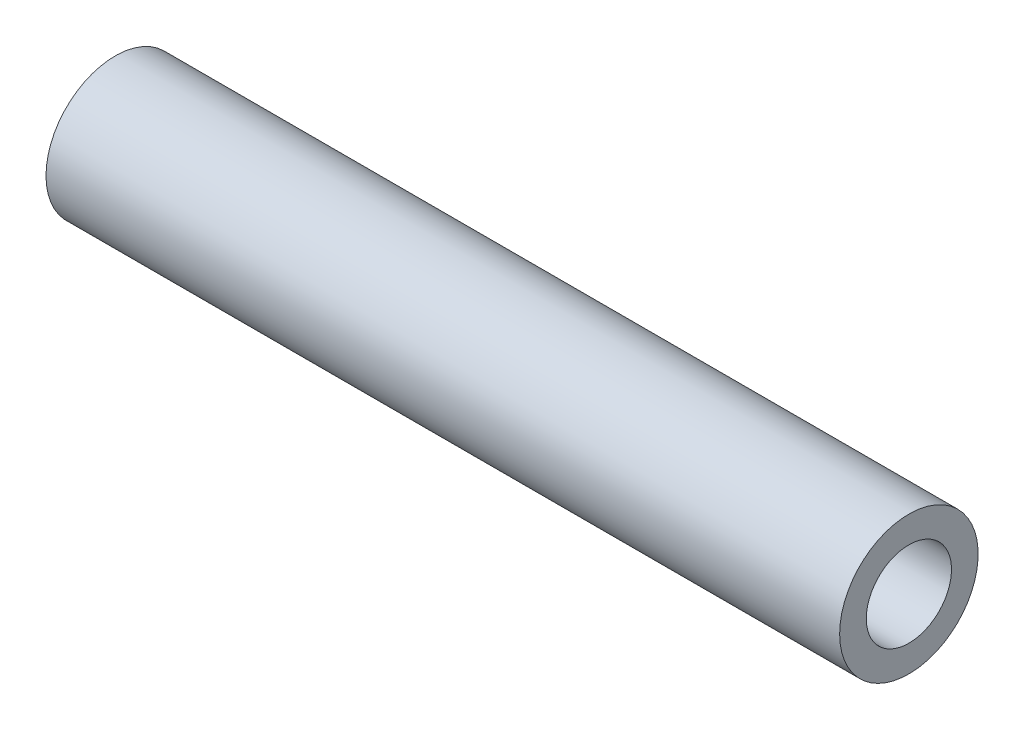
ISO-10303-21;
HEADER;
FILE_DESCRIPTION(('STEP AP214'),'2;1');
FILE_NAME('part.step','',(''),(''),'','','');
FILE_SCHEMA(('AUTOMOTIVE_DESIGN { 1 0 10303 214 1 1 1 1 }'));
ENDSEC;
DATA;
#1=APPLICATION_CONTEXT('core data for automotive mechanical design processes');
#2=APPLICATION_PROTOCOL_DEFINITION('international standard','automotive_design',2000,#1);
#3=PRODUCT_CONTEXT('',#1,'mechanical');
#4=PRODUCT('Part','Part','',(#3));
#5=PRODUCT_RELATED_PRODUCT_CATEGORY('part','',(#4));
#6=PRODUCT_DEFINITION_FORMATION('','',#4);
#7=PRODUCT_DEFINITION_CONTEXT('part definition',#1,'design');
#8=PRODUCT_DEFINITION('design','',#6,#7);
#9=PRODUCT_DEFINITION_SHAPE('','',#8);
#10=(LENGTH_UNIT() NAMED_UNIT(*) SI_UNIT(.MILLI.,.METRE.));
#11=(NAMED_UNIT(*) PLANE_ANGLE_UNIT() SI_UNIT($,.RADIAN.));
#12=(NAMED_UNIT(*) SI_UNIT($,.STERADIAN.) SOLID_ANGLE_UNIT());
#13=UNCERTAINTY_MEASURE_WITH_UNIT(LENGTH_MEASURE(1.E-05),#10,'distance_accuracy_value','');
#14=(GEOMETRIC_REPRESENTATION_CONTEXT(3) GLOBAL_UNCERTAINTY_ASSIGNED_CONTEXT((#13)) GLOBAL_UNIT_ASSIGNED_CONTEXT((#10,
#11,#12)) REPRESENTATION_CONTEXT('',''));
#15=CARTESIAN_POINT('',(0.,0.,0.));
#16=DIRECTION('',(0.,0.,1.));
#17=DIRECTION('',(1.,0.,0.));
#18=AXIS2_PLACEMENT_3D('',#15,#16,#17);
#19=CARTESIAN_POINT('',(-74.5,8.,0.));
#20=DIRECTION('',(1.,0.,0.));
#21=DIRECTION('',(0.,0.,-1.));
#22=AXIS2_PLACEMENT_3D('',#19,#20,#21);
#23=PLANE('',#22);
#24=CARTESIAN_POINT('',(-74.5,0.,0.));
#25=DIRECTION('',(-1.,0.,0.));
#26=DIRECTION('',(0.,0.,1.));
#27=AXIS2_PLACEMENT_3D('',#24,#25,#26);
#28=CIRCLE('',#27,8.);
#29=CARTESIAN_POINT('',(-74.5,0.,8.));
#30=VERTEX_POINT('',#29);
#31=EDGE_CURVE('E58',#30,#30,#28,.T.);
#32=ORIENTED_EDGE('',*,*,#31,.F.);
#33=EDGE_LOOP('',(#32));
#34=FACE_BOUND('',#33,.T.);
#35=CARTESIAN_POINT('',(-74.5,0.,0.));
#36=DIRECTION('',(-1.,0.,0.));
#37=DIRECTION('',(0.,0.,1.));
#38=AXIS2_PLACEMENT_3D('',#35,#36,#37);
#39=CIRCLE('',#38,13.);
#40=CARTESIAN_POINT('',(-74.5,0.,13.));
#41=VERTEX_POINT('',#40);
#42=EDGE_CURVE('E10',#41,#41,#39,.T.);
#43=ORIENTED_EDGE('',*,*,#42,.T.);
#44=EDGE_LOOP('',(#43));
#45=FACE_BOUND('',#44,.T.);
#46=ADVANCED_FACE('F43',(#34,#45),#23,.F.);
#47=CARTESIAN_POINT('',(-101.395540412834,0.,0.));
#48=DIRECTION('',(-1.,0.,0.));
#49=DIRECTION('',(0.,0.,1.));
#50=AXIS2_PLACEMENT_3D('',#47,#48,#49);
#51=CYLINDRICAL_SURFACE('',#50,13.);
#52=ORIENTED_EDGE('',*,*,#42,.F.);
#53=EDGE_LOOP('',(#52));
#54=FACE_BOUND('',#53,.T.);
#55=CARTESIAN_POINT('',(74.5,0.,0.));
#56=DIRECTION('',(-1.,0.,0.));
#57=DIRECTION('',(0.,0.,1.));
#58=AXIS2_PLACEMENT_3D('',#55,#56,#57);
#59=CIRCLE('',#58,13.);
#60=CARTESIAN_POINT('',(74.5,0.,13.));
#61=VERTEX_POINT('',#60);
#62=EDGE_CURVE('E49',#61,#61,#59,.T.);
#63=ORIENTED_EDGE('',*,*,#62,.T.);
#64=EDGE_LOOP('',(#63));
#65=FACE_BOUND('',#64,.T.);
#66=ADVANCED_FACE('F68',(#54,#65),#51,.T.);
#67=CARTESIAN_POINT('',(74.5,13.,0.));
#68=DIRECTION('',(-1.,0.,0.));
#69=DIRECTION('',(0.,0.,1.));
#70=AXIS2_PLACEMENT_3D('',#67,#68,#69);
#71=PLANE('',#70);
#72=ORIENTED_EDGE('',*,*,#62,.F.);
#73=EDGE_LOOP('',(#72));
#74=FACE_BOUND('',#73,.T.);
#75=CARTESIAN_POINT('',(74.5,0.,0.));
#76=DIRECTION('',(-1.,0.,0.));
#77=DIRECTION('',(0.,0.,1.));
#78=AXIS2_PLACEMENT_3D('',#75,#76,#77);
#79=CIRCLE('',#78,8.);
#80=CARTESIAN_POINT('',(74.5,0.,8.));
#81=VERTEX_POINT('',#80);
#82=EDGE_CURVE('E54',#81,#81,#79,.T.);
#83=ORIENTED_EDGE('',*,*,#82,.T.);
#84=EDGE_LOOP('',(#83));
#85=FACE_BOUND('',#84,.T.);
#86=ADVANCED_FACE('F73',(#74,#85),#71,.F.);
#87=CARTESIAN_POINT('',(-101.395540412834,0.,0.));
#88=DIRECTION('',(-1.,0.,0.));
#89=DIRECTION('',(0.,0.,1.));
#90=AXIS2_PLACEMENT_3D('',#87,#88,#89);
#91=CYLINDRICAL_SURFACE('',#90,8.);
#92=ORIENTED_EDGE('',*,*,#82,.F.);
#93=EDGE_LOOP('',(#92));
#94=FACE_BOUND('',#93,.T.);
#95=ORIENTED_EDGE('',*,*,#31,.T.);
#96=EDGE_LOOP('',(#95));
#97=FACE_BOUND('',#96,.T.);
#98=ADVANCED_FACE('F70',(#94,#97),#91,.F.);
#99=CLOSED_SHELL('',(#46,#66,#86,#98));
#100=MANIFOLD_SOLID_BREP('B2',#99);
#101=ADVANCED_BREP_SHAPE_REPRESENTATION('',(#18,#100),#14);
#102=SHAPE_DEFINITION_REPRESENTATION(#9,#101);
ENDSEC;
END-ISO-10303-21;
